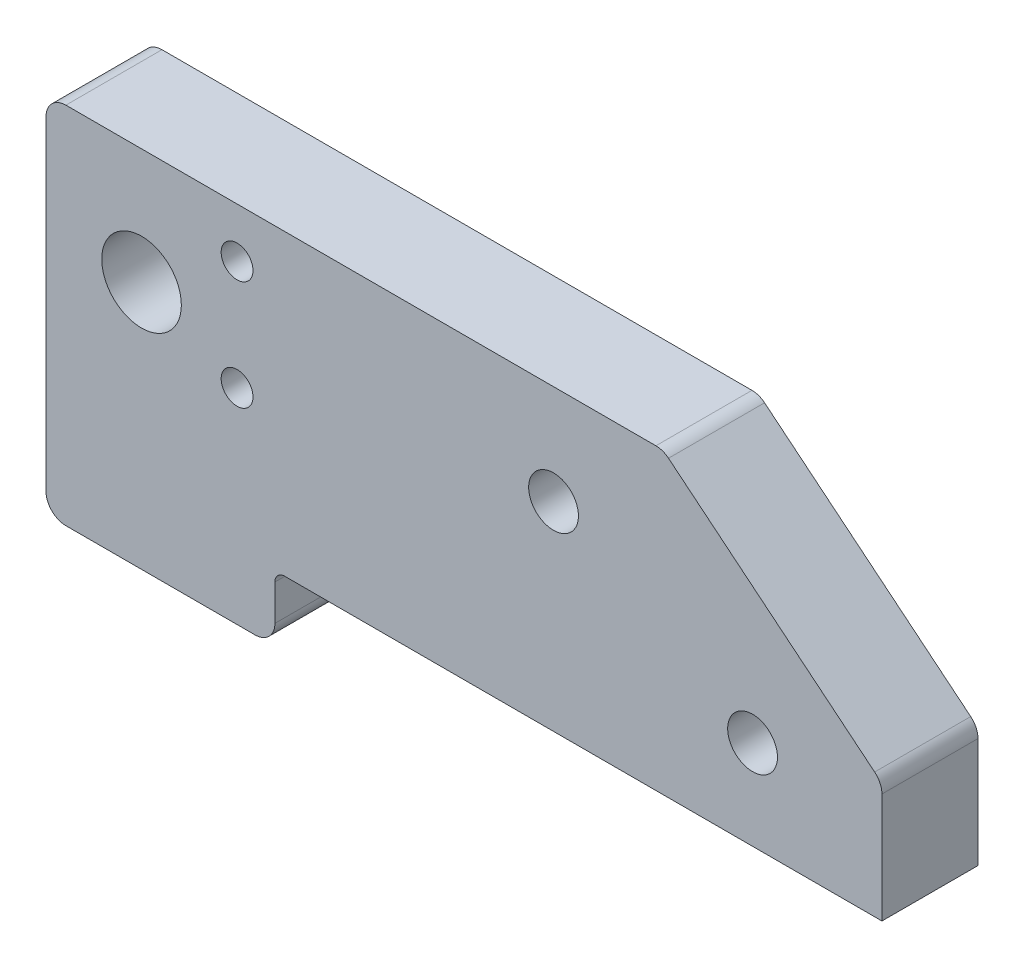
ISO-10303-21;
HEADER;
FILE_DESCRIPTION(('STEP AP214'),'2;1');
FILE_NAME('part.step','',(''),(''),'','','');
FILE_SCHEMA(('AUTOMOTIVE_DESIGN { 1 0 10303 214 1 1 1 1 }'));
ENDSEC;
DATA;
#1=APPLICATION_CONTEXT('core data for automotive mechanical design processes');
#2=APPLICATION_PROTOCOL_DEFINITION('international standard','automotive_design',2000,#1);
#3=PRODUCT_CONTEXT('',#1,'mechanical');
#4=PRODUCT('Part','Part','',(#3));
#5=PRODUCT_RELATED_PRODUCT_CATEGORY('part','',(#4));
#6=PRODUCT_DEFINITION_FORMATION('','',#4);
#7=PRODUCT_DEFINITION_CONTEXT('part definition',#1,'design');
#8=PRODUCT_DEFINITION('design','',#6,#7);
#9=PRODUCT_DEFINITION_SHAPE('','',#8);
#10=(LENGTH_UNIT() NAMED_UNIT(*) SI_UNIT(.MILLI.,.METRE.));
#11=(NAMED_UNIT(*) PLANE_ANGLE_UNIT() SI_UNIT($,.RADIAN.));
#12=(NAMED_UNIT(*) SI_UNIT($,.STERADIAN.) SOLID_ANGLE_UNIT());
#13=UNCERTAINTY_MEASURE_WITH_UNIT(LENGTH_MEASURE(1.E-05),#10,'distance_accuracy_value','');
#14=(GEOMETRIC_REPRESENTATION_CONTEXT(3) GLOBAL_UNCERTAINTY_ASSIGNED_CONTEXT((#13)) GLOBAL_UNIT_ASSIGNED_CONTEXT((#10,
#11,#12)) REPRESENTATION_CONTEXT('',''));
#15=CARTESIAN_POINT('',(0.,0.,0.));
#16=DIRECTION('',(0.,0.,1.));
#17=DIRECTION('',(1.,0.,0.));
#18=AXIS2_PLACEMENT_3D('',#15,#16,#17);
#19=CARTESIAN_POINT('',(0.,0.,4.826));
#20=DIRECTION('',(0.,-1.,0.));
#21=DIRECTION('',(1.,0.,0.));
#22=AXIS2_PLACEMENT_3D('',#19,#20,#21);
#23=PLANE('',#22);
#24=CARTESIAN_POINT('',(-4.,0.,2.413));
#25=DIRECTION('',(0.,-1.,0.));
#26=DIRECTION('',(0.,0.,-1.));
#27=AXIS2_PLACEMENT_3D('',#24,#25,#26);
#28=CIRCLE('',#27,1.24999999999999);
#29=CARTESIAN_POINT('',(-4.,0.,1.16300000000001));
#30=VERTEX_POINT('',#29);
#31=EDGE_CURVE('E146',#30,#30,#28,.T.);
#32=ORIENTED_EDGE('',*,*,#31,.F.);
#33=EDGE_LOOP('',(#32));
#34=FACE_BOUND('',#33,.T.);
#35=CARTESIAN_POINT('',(8.,0.,2.413));
#36=DIRECTION('',(0.,-1.,0.));
#37=DIRECTION('',(0.,0.,-1.));
#38=AXIS2_PLACEMENT_3D('',#35,#36,#37);
#39=CIRCLE('',#38,1.24999999999999);
#40=CARTESIAN_POINT('',(8.,0.,1.16300000000001));
#41=VERTEX_POINT('',#40);
#42=EDGE_CURVE('E145',#41,#41,#39,.T.);
#43=ORIENTED_EDGE('',*,*,#42,.F.);
#44=EDGE_LOOP('',(#43));
#45=FACE_BOUND('',#44,.T.);
#46=DIRECTION('',(-1.,0.,0.));
#47=VECTOR('',#46,1.);
#48=CARTESIAN_POINT('',(0.,0.,4.826));
#49=LINE('',#48,#47);
#50=CARTESIAN_POINT('',(11.,0.,4.826));
#51=VERTEX_POINT('',#50);
#52=CARTESIAN_POINT('',(-19.,0.,4.826));
#53=VERTEX_POINT('',#52);
#54=EDGE_CURVE('E165',#51,#53,#49,.T.);
#55=ORIENTED_EDGE('',*,*,#54,.T.);
#56=DIRECTION('',(0.,0.,-1.));
#57=VECTOR('',#56,1.);
#58=CARTESIAN_POINT('',(-19.,0.,0.));
#59=LINE('',#58,#57);
#60=CARTESIAN_POINT('',(-19.,0.,0.));
#61=VERTEX_POINT('',#60);
#62=EDGE_CURVE('E234',#53,#61,#59,.T.);
#63=ORIENTED_EDGE('',*,*,#62,.T.);
#64=DIRECTION('',(-1.,0.,0.));
#65=VECTOR('',#64,1.);
#66=CARTESIAN_POINT('',(0.,0.,0.));
#67=LINE('',#66,#65);
#68=CARTESIAN_POINT('',(11.,0.,0.));
#69=VERTEX_POINT('',#68);
#70=EDGE_CURVE('E164',#69,#61,#67,.T.);
#71=ORIENTED_EDGE('',*,*,#70,.F.);
#72=DIRECTION('',(0.,0.,-1.));
#73=VECTOR('',#72,1.);
#74=CARTESIAN_POINT('',(11.,0.,4.826));
#75=LINE('',#74,#73);
#76=EDGE_CURVE('E177',#51,#69,#75,.T.);
#77=ORIENTED_EDGE('',*,*,#76,.F.);
#78=EDGE_LOOP('',(#55,#63,#71,#77));
#79=FACE_BOUND('',#78,.T.);
#80=ADVANCED_FACE('F38',(#34,#45,#79),#23,.T.);
#81=CARTESIAN_POINT('',(11.,0.,4.826));
#82=DIRECTION('',(1.,0.,0.));
#83=DIRECTION('',(0.,1.,0.));
#84=AXIS2_PLACEMENT_3D('',#81,#82,#83);
#85=PLANE('',#84);
#86=DIRECTION('',(0.,-1.,0.));
#87=VECTOR('',#86,1.);
#88=CARTESIAN_POINT('',(11.,0.,0.));
#89=LINE('',#88,#87);
#90=CARTESIAN_POINT('',(11.,5.52612087240437,0.));
#91=VERTEX_POINT('',#90);
#92=EDGE_CURVE('E179',#91,#69,#89,.T.);
#93=ORIENTED_EDGE('',*,*,#92,.F.);
#94=DIRECTION('',(0.,0.,-1.));
#95=VECTOR('',#94,1.);
#96=CARTESIAN_POINT('',(11.,5.52612087240437,4.826));
#97=LINE('',#96,#95);
#98=CARTESIAN_POINT('',(11.,5.52612087240437,4.826));
#99=VERTEX_POINT('',#98);
#100=EDGE_CURVE('E203',#91,#99,#97,.F.);
#101=ORIENTED_EDGE('',*,*,#100,.T.);
#102=DIRECTION('',(0.,-1.,0.));
#103=VECTOR('',#102,1.);
#104=CARTESIAN_POINT('',(11.,0.,4.826));
#105=LINE('',#104,#103);
#106=EDGE_CURVE('E168',#99,#51,#105,.T.);
#107=ORIENTED_EDGE('',*,*,#106,.T.);
#108=ORIENTED_EDGE('',*,*,#76,.T.);
#109=EDGE_LOOP('',(#93,#101,#107,#108));
#110=FACE_BOUND('',#109,.T.);
#111=ADVANCED_FACE('F249',(#110),#85,.T.);
#112=CARTESIAN_POINT('',(7.35148514851485,8.98514851485148,4.826));
#113=DIRECTION('',(0.633237790257263,0.773957299203321,0.));
#114=DIRECTION('',(-0.773957299203321,0.633237790257263,0.));
#115=AXIS2_PLACEMENT_3D('',#112,#113,#114);
#116=PLANE('',#115);
#117=DIRECTION('',(0.773957299203321,-0.633237790257263,0.));
#118=VECTOR('',#117,1.);
#119=CARTESIAN_POINT('',(7.35148514851485,8.98514851485148,4.826));
#120=LINE('',#119,#118);
#121=CARTESIAN_POINT('',(0.276274412084827,14.7739572992033,4.826));
#122=VERTEX_POINT('',#121);
#123=CARTESIAN_POINT('',(10.6332377902573,6.3000781716077,4.826));
#124=VERTEX_POINT('',#123);
#125=EDGE_CURVE('E171',#122,#124,#120,.T.);
#126=ORIENTED_EDGE('',*,*,#125,.T.);
#127=DIRECTION('',(0.,0.,-1.));
#128=VECTOR('',#127,1.);
#129=CARTESIAN_POINT('',(10.6332377902573,6.3000781716077,4.826));
#130=LINE('',#129,#128);
#131=CARTESIAN_POINT('',(10.6332377902573,6.3000781716077,0.));
#132=VERTEX_POINT('',#131);
#133=EDGE_CURVE('E190',#124,#132,#130,.T.);
#134=ORIENTED_EDGE('',*,*,#133,.T.);
#135=DIRECTION('',(0.773957299203321,-0.633237790257263,0.));
#136=VECTOR('',#135,1.);
#137=CARTESIAN_POINT('',(7.35148514851485,8.98514851485148,0.));
#138=LINE('',#137,#136);
#139=CARTESIAN_POINT('',(0.276274412084827,14.7739572992033,0.));
#140=VERTEX_POINT('',#139);
#141=EDGE_CURVE('E181',#140,#132,#138,.T.);
#142=ORIENTED_EDGE('',*,*,#141,.F.);
#143=DIRECTION('',(0.,0.,-1.));
#144=VECTOR('',#143,1.);
#145=CARTESIAN_POINT('',(0.276274412084828,14.7739572992033,4.826));
#146=LINE('',#145,#144);
#147=EDGE_CURVE('E188',#140,#122,#146,.F.);
#148=ORIENTED_EDGE('',*,*,#147,.T.);
#149=EDGE_LOOP('',(#126,#134,#142,#148));
#150=FACE_BOUND('',#149,.T.);
#151=ADVANCED_FACE('F270',(#150),#116,.T.);
#152=CARTESIAN_POINT('',(0.,15.,4.826));
#153=DIRECTION('',(0.,-1.,0.));
#154=DIRECTION('',(1.,0.,0.));
#155=AXIS2_PLACEMENT_3D('',#152,#153,#154);
#156=PLANE('',#155);
#157=DIRECTION('',(-1.,0.,0.));
#158=VECTOR('',#157,1.);
#159=CARTESIAN_POINT('',(0.,15.,4.826));
#160=LINE('',#159,#158);
#161=CARTESIAN_POINT('',(-0.356963378172435,15.,4.826));
#162=VERTEX_POINT('',#161);
#163=CARTESIAN_POINT('',(-30.,15.,4.826));
#164=VERTEX_POINT('',#163);
#165=EDGE_CURVE('E174',#162,#164,#160,.T.);
#166=ORIENTED_EDGE('',*,*,#165,.F.);
#167=DIRECTION('',(0.,0.,-1.));
#168=VECTOR('',#167,1.);
#169=CARTESIAN_POINT('',(-0.356963378172435,15.,0.));
#170=LINE('',#169,#168);
#171=CARTESIAN_POINT('',(-0.356963378172435,15.,0.));
#172=VERTEX_POINT('',#171);
#173=EDGE_CURVE('E218',#162,#172,#170,.T.);
#174=ORIENTED_EDGE('',*,*,#173,.T.);
#175=DIRECTION('',(-1.,0.,0.));
#176=VECTOR('',#175,1.);
#177=CARTESIAN_POINT('',(0.,15.,0.));
#178=LINE('',#177,#176);
#179=CARTESIAN_POINT('',(-30.,15.,0.));
#180=VERTEX_POINT('',#179);
#181=EDGE_CURVE('E169',#172,#180,#178,.T.);
#182=ORIENTED_EDGE('',*,*,#181,.T.);
#183=DIRECTION('',(0.,0.,-1.));
#184=VECTOR('',#183,1.);
#185=CARTESIAN_POINT('',(-30.,15.,4.826));
#186=LINE('',#185,#184);
#187=EDGE_CURVE('E216',#180,#164,#186,.F.);
#188=ORIENTED_EDGE('',*,*,#187,.T.);
#189=EDGE_LOOP('',(#166,#174,#182,#188));
#190=FACE_BOUND('',#189,.T.);
#191=ADVANCED_FACE('F339',(#190),#156,.F.);
#192=CARTESIAN_POINT('',(0.,0.,4.826));
#193=DIRECTION('',(0.,0.,1.));
#194=DIRECTION('',(1.,0.,0.));
#195=AXIS2_PLACEMENT_3D('',#192,#193,#194);
#196=PLANE('',#195);
#197=CARTESIAN_POINT('',(-21.4,12.5,4.826));
#198=DIRECTION('',(0.,0.,1.));
#199=DIRECTION('',(1.,0.,0.));
#200=AXIS2_PLACEMENT_3D('',#197,#198,#199);
#201=CIRCLE('',#200,0.800000000000012);
#202=CARTESIAN_POINT('',(-20.6,12.5,4.826));
#203=VERTEX_POINT('',#202);
#204=EDGE_CURVE('E592',#203,#203,#201,.T.);
#205=ORIENTED_EDGE('',*,*,#204,.F.);
#206=EDGE_LOOP('',(#205));
#207=FACE_BOUND('',#206,.T.);
#208=CARTESIAN_POINT('',(-21.4,7.,4.826));
#209=DIRECTION('',(0.,0.,1.));
#210=DIRECTION('',(1.,0.,0.));
#211=AXIS2_PLACEMENT_3D('',#208,#209,#210);
#212=CIRCLE('',#211,0.800000000000012);
#213=CARTESIAN_POINT('',(-20.6,7.,4.826));
#214=VERTEX_POINT('',#213);
#215=EDGE_CURVE('E586',#214,#214,#212,.T.);
#216=ORIENTED_EDGE('',*,*,#215,.F.);
#217=EDGE_LOOP('',(#216));
#218=FACE_BOUND('',#217,.T.);
#219=CARTESIAN_POINT('',(4.5,4.5,4.826));
#220=DIRECTION('',(0.,0.,1.));
#221=DIRECTION('',(1.,0.,0.));
#222=AXIS2_PLACEMENT_3D('',#219,#220,#221);
#223=CIRCLE('',#222,1.24999999999999);
#224=CARTESIAN_POINT('',(5.74999999999999,4.5,4.826));
#225=VERTEX_POINT('',#224);
#226=EDGE_CURVE('E322',#225,#225,#223,.T.);
#227=ORIENTED_EDGE('',*,*,#226,.F.);
#228=EDGE_LOOP('',(#227));
#229=FACE_BOUND('',#228,.T.);
#230=CARTESIAN_POINT('',(-5.5,10.,4.826));
#231=DIRECTION('',(0.,0.,1.));
#232=DIRECTION('',(1.,0.,0.));
#233=AXIS2_PLACEMENT_3D('',#230,#231,#232);
#234=CIRCLE('',#233,1.25);
#235=CARTESIAN_POINT('',(-4.25,10.,4.826));
#236=VERTEX_POINT('',#235);
#237=EDGE_CURVE('E158',#236,#236,#234,.T.);
#238=ORIENTED_EDGE('',*,*,#237,.F.);
#239=EDGE_LOOP('',(#238));
#240=FACE_BOUND('',#239,.T.);
#241=ORIENTED_EDGE('',*,*,#106,.F.);
#242=CARTESIAN_POINT('',(10.,5.52612087240437,4.826));
#243=DIRECTION('',(0.,0.,1.));
#244=DIRECTION('',(1.,0.,0.));
#245=AXIS2_PLACEMENT_3D('',#242,#243,#244);
#246=CIRCLE('',#245,1.);
#247=EDGE_CURVE('E214',#99,#124,#246,.T.);
#248=ORIENTED_EDGE('',*,*,#247,.T.);
#249=ORIENTED_EDGE('',*,*,#125,.F.);
#250=CARTESIAN_POINT('',(-0.356963378172434,14.,4.826));
#251=DIRECTION('',(0.,0.,1.));
#252=DIRECTION('',(1.,0.,0.));
#253=AXIS2_PLACEMENT_3D('',#250,#251,#252);
#254=CIRCLE('',#253,1.);
#255=EDGE_CURVE('E212',#122,#162,#254,.T.);
#256=ORIENTED_EDGE('',*,*,#255,.T.);
#257=ORIENTED_EDGE('',*,*,#165,.T.);
#258=CARTESIAN_POINT('',(-30.,14.,4.826));
#259=DIRECTION('',(0.,0.,1.));
#260=DIRECTION('',(1.,0.,0.));
#261=AXIS2_PLACEMENT_3D('',#258,#259,#260);
#262=CIRCLE('',#261,1.);
#263=CARTESIAN_POINT('',(-31.,14.,4.826));
#264=VERTEX_POINT('',#263);
#265=EDGE_CURVE('E210',#164,#264,#262,.T.);
#266=ORIENTED_EDGE('',*,*,#265,.T.);
#267=DIRECTION('',(0.,1.,0.));
#268=VECTOR('',#267,1.);
#269=CARTESIAN_POINT('',(-31.,0.,4.826));
#270=LINE('',#269,#268);
#271=CARTESIAN_POINT('',(-31.,-2.3,4.826));
#272=VERTEX_POINT('',#271);
#273=EDGE_CURVE('E309',#272,#264,#270,.T.);
#274=ORIENTED_EDGE('',*,*,#273,.F.);
#275=CARTESIAN_POINT('',(-30.,-2.3,4.826));
#276=DIRECTION('',(0.,0.,1.));
#277=DIRECTION('',(1.,0.,0.));
#278=AXIS2_PLACEMENT_3D('',#275,#276,#277);
#279=CIRCLE('',#278,1.);
#280=CARTESIAN_POINT('',(-30.,-3.3,4.826));
#281=VERTEX_POINT('',#280);
#282=EDGE_CURVE('E205',#272,#281,#279,.T.);
#283=ORIENTED_EDGE('',*,*,#282,.T.);
#284=DIRECTION('',(-1.,0.,0.));
#285=VECTOR('',#284,1.);
#286=CARTESIAN_POINT('',(0.,-3.3,4.826));
#287=LINE('',#286,#285);
#288=CARTESIAN_POINT('',(-20.5,-3.3,4.826));
#289=VERTEX_POINT('',#288);
#290=EDGE_CURVE('E306',#289,#281,#287,.T.);
#291=ORIENTED_EDGE('',*,*,#290,.F.);
#292=CARTESIAN_POINT('',(-20.5,-2.3,4.826));
#293=DIRECTION('',(0.,0.,1.));
#294=DIRECTION('',(1.,0.,0.));
#295=AXIS2_PLACEMENT_3D('',#292,#293,#294);
#296=CIRCLE('',#295,1.);
#297=CARTESIAN_POINT('',(-19.5,-2.3,4.826));
#298=VERTEX_POINT('',#297);
#299=EDGE_CURVE('E207',#289,#298,#296,.T.);
#300=ORIENTED_EDGE('',*,*,#299,.T.);
#301=DIRECTION('',(0.,-1.,0.));
#302=VECTOR('',#301,1.);
#303=CARTESIAN_POINT('',(-19.5,0.,4.826));
#304=LINE('',#303,#302);
#305=CARTESIAN_POINT('',(-19.5,-0.5,4.826));
#306=VERTEX_POINT('',#305);
#307=EDGE_CURVE('E255',#306,#298,#304,.T.);
#308=ORIENTED_EDGE('',*,*,#307,.F.);
#309=CARTESIAN_POINT('',(-19.,-0.5,4.826));
#310=DIRECTION('',(0.,0.,1.));
#311=DIRECTION('',(1.,0.,0.));
#312=AXIS2_PLACEMENT_3D('',#309,#310,#311);
#313=CIRCLE('',#312,0.5);
#314=EDGE_CURVE('E11',#306,#53,#313,.F.);
#315=ORIENTED_EDGE('',*,*,#314,.T.);
#316=ORIENTED_EDGE('',*,*,#54,.F.);
#317=EDGE_LOOP('',(#241,#248,#249,#256,#257,#266,#274,#283,#291,#300,#308,#315,#316));
#318=FACE_BOUND('',#317,.T.);
#319=CARTESIAN_POINT('',(-26.2,9.2,4.826));
#320=DIRECTION('',(0.,0.,1.));
#321=DIRECTION('',(1.,0.,0.));
#322=AXIS2_PLACEMENT_3D('',#319,#320,#321);
#323=CIRCLE('',#322,2.);
#324=CARTESIAN_POINT('',(-24.2,9.2,4.826));
#325=VERTEX_POINT('',#324);
#326=EDGE_CURVE('E316',#325,#325,#323,.T.);
#327=ORIENTED_EDGE('',*,*,#326,.F.);
#328=EDGE_LOOP('',(#327));
#329=FACE_BOUND('',#328,.T.);
#330=ADVANCED_FACE('F252',(#207,#218,#229,#240,#318,#329),#196,.T.);
#331=CARTESIAN_POINT('',(0.,0.,0.));
#332=DIRECTION('',(0.,0.,1.));
#333=DIRECTION('',(1.,0.,0.));
#334=AXIS2_PLACEMENT_3D('',#331,#332,#333);
#335=PLANE('',#334);
#336=CARTESIAN_POINT('',(-21.4,12.5,0.));
#337=DIRECTION('',(0.,0.,1.));
#338=DIRECTION('',(1.,0.,0.));
#339=AXIS2_PLACEMENT_3D('',#336,#337,#338);
#340=CIRCLE('',#339,0.800000000000012);
#341=CARTESIAN_POINT('',(-20.6,12.5,0.));
#342=VERTEX_POINT('',#341);
#343=EDGE_CURVE('E589',#342,#342,#340,.T.);
#344=ORIENTED_EDGE('',*,*,#343,.T.);
#345=EDGE_LOOP('',(#344));
#346=FACE_BOUND('',#345,.T.);
#347=CARTESIAN_POINT('',(-21.4,7.,0.));
#348=DIRECTION('',(0.,0.,1.));
#349=DIRECTION('',(1.,0.,0.));
#350=AXIS2_PLACEMENT_3D('',#347,#348,#349);
#351=CIRCLE('',#350,0.800000000000012);
#352=CARTESIAN_POINT('',(-20.6,7.,0.));
#353=VERTEX_POINT('',#352);
#354=EDGE_CURVE('E318',#353,#353,#351,.T.);
#355=ORIENTED_EDGE('',*,*,#354,.T.);
#356=EDGE_LOOP('',(#355));
#357=FACE_BOUND('',#356,.T.);
#358=CARTESIAN_POINT('',(4.5,4.5,0.));
#359=DIRECTION('',(0.,0.,1.));
#360=DIRECTION('',(1.,0.,0.));
#361=AXIS2_PLACEMENT_3D('',#358,#359,#360);
#362=CIRCLE('',#361,1.25);
#363=CARTESIAN_POINT('',(5.75,4.5,0.));
#364=VERTEX_POINT('',#363);
#365=EDGE_CURVE('E152',#364,#364,#362,.T.);
#366=ORIENTED_EDGE('',*,*,#365,.T.);
#367=EDGE_LOOP('',(#366));
#368=FACE_BOUND('',#367,.T.);
#369=CARTESIAN_POINT('',(-5.5,10.,0.));
#370=DIRECTION('',(0.,0.,1.));
#371=DIRECTION('',(1.,0.,0.));
#372=AXIS2_PLACEMENT_3D('',#369,#370,#371);
#373=CIRCLE('',#372,1.25);
#374=CARTESIAN_POINT('',(-4.25,10.,0.));
#375=VERTEX_POINT('',#374);
#376=EDGE_CURVE('E161',#375,#375,#373,.T.);
#377=ORIENTED_EDGE('',*,*,#376,.T.);
#378=EDGE_LOOP('',(#377));
#379=FACE_BOUND('',#378,.T.);
#380=ORIENTED_EDGE('',*,*,#141,.T.);
#381=CARTESIAN_POINT('',(10.,5.52612087240437,0.));
#382=DIRECTION('',(0.,0.,1.));
#383=DIRECTION('',(1.,0.,0.));
#384=AXIS2_PLACEMENT_3D('',#381,#382,#383);
#385=CIRCLE('',#384,1.);
#386=EDGE_CURVE('E201',#132,#91,#385,.F.);
#387=ORIENTED_EDGE('',*,*,#386,.T.);
#388=ORIENTED_EDGE('',*,*,#92,.T.);
#389=ORIENTED_EDGE('',*,*,#70,.T.);
#390=CARTESIAN_POINT('',(-19.,-0.5,0.));
#391=DIRECTION('',(0.,0.,1.));
#392=DIRECTION('',(1.,0.,0.));
#393=AXIS2_PLACEMENT_3D('',#390,#391,#392);
#394=CIRCLE('',#393,0.5);
#395=CARTESIAN_POINT('',(-19.5,-0.5,0.));
#396=VERTEX_POINT('',#395);
#397=EDGE_CURVE('E46',#61,#396,#394,.T.);
#398=ORIENTED_EDGE('',*,*,#397,.T.);
#399=DIRECTION('',(0.,-1.,0.));
#400=VECTOR('',#399,1.);
#401=CARTESIAN_POINT('',(-19.5,0.,0.));
#402=LINE('',#401,#400);
#403=CARTESIAN_POINT('',(-19.5,-2.3,0.));
#404=VERTEX_POINT('',#403);
#405=EDGE_CURVE('E382',#396,#404,#402,.T.);
#406=ORIENTED_EDGE('',*,*,#405,.T.);
#407=CARTESIAN_POINT('',(-20.5,-2.3,0.));
#408=DIRECTION('',(0.,0.,1.));
#409=DIRECTION('',(1.,0.,0.));
#410=AXIS2_PLACEMENT_3D('',#407,#408,#409);
#411=CIRCLE('',#410,1.);
#412=CARTESIAN_POINT('',(-20.5,-3.3,0.));
#413=VERTEX_POINT('',#412);
#414=EDGE_CURVE('E195',#404,#413,#411,.F.);
#415=ORIENTED_EDGE('',*,*,#414,.T.);
#416=DIRECTION('',(-1.,0.,0.));
#417=VECTOR('',#416,1.);
#418=CARTESIAN_POINT('',(0.,-3.3,0.));
#419=LINE('',#418,#417);
#420=CARTESIAN_POINT('',(-30.,-3.3,0.));
#421=VERTEX_POINT('',#420);
#422=EDGE_CURVE('E380',#413,#421,#419,.T.);
#423=ORIENTED_EDGE('',*,*,#422,.T.);
#424=CARTESIAN_POINT('',(-30.,-2.3,0.));
#425=DIRECTION('',(0.,0.,1.));
#426=DIRECTION('',(1.,0.,0.));
#427=AXIS2_PLACEMENT_3D('',#424,#425,#426);
#428=CIRCLE('',#427,1.);
#429=CARTESIAN_POINT('',(-31.,-2.3,0.));
#430=VERTEX_POINT('',#429);
#431=EDGE_CURVE('E193',#421,#430,#428,.F.);
#432=ORIENTED_EDGE('',*,*,#431,.T.);
#433=DIRECTION('',(0.,1.,0.));
#434=VECTOR('',#433,1.);
#435=CARTESIAN_POINT('',(-31.,0.,0.));
#436=LINE('',#435,#434);
#437=CARTESIAN_POINT('',(-31.,14.,0.));
#438=VERTEX_POINT('',#437);
#439=EDGE_CURVE('E324',#430,#438,#436,.T.);
#440=ORIENTED_EDGE('',*,*,#439,.T.);
#441=CARTESIAN_POINT('',(-30.,14.,0.));
#442=DIRECTION('',(0.,0.,1.));
#443=DIRECTION('',(1.,0.,0.));
#444=AXIS2_PLACEMENT_3D('',#441,#442,#443);
#445=CIRCLE('',#444,1.);
#446=EDGE_CURVE('E197',#438,#180,#445,.F.);
#447=ORIENTED_EDGE('',*,*,#446,.T.);
#448=ORIENTED_EDGE('',*,*,#181,.F.);
#449=CARTESIAN_POINT('',(-0.356963378172434,14.,0.));
#450=DIRECTION('',(0.,0.,1.));
#451=DIRECTION('',(1.,0.,0.));
#452=AXIS2_PLACEMENT_3D('',#449,#450,#451);
#453=CIRCLE('',#452,1.);
#454=EDGE_CURVE('E199',#172,#140,#453,.F.);
#455=ORIENTED_EDGE('',*,*,#454,.T.);
#456=EDGE_LOOP('',(#380,#387,#388,#389,#398,#406,#415,#423,#432,#440,#447,#448,#455));
#457=FACE_BOUND('',#456,.T.);
#458=CARTESIAN_POINT('',(-26.2,9.2,0.));
#459=DIRECTION('',(0.,0.,1.));
#460=DIRECTION('',(1.,0.,0.));
#461=AXIS2_PLACEMENT_3D('',#458,#459,#460);
#462=CIRCLE('',#461,2.);
#463=CARTESIAN_POINT('',(-24.2,9.2,0.));
#464=VERTEX_POINT('',#463);
#465=EDGE_CURVE('E386',#464,#464,#462,.T.);
#466=ORIENTED_EDGE('',*,*,#465,.T.);
#467=EDGE_LOOP('',(#466));
#468=FACE_BOUND('',#467,.T.);
#469=ADVANCED_FACE('F244',(#346,#357,#368,#379,#457,#468),#335,.F.);
#470=CARTESIAN_POINT('',(-5.5,10.,4.826));
#471=DIRECTION('',(0.,0.,1.));
#472=DIRECTION('',(1.,0.,0.));
#473=AXIS2_PLACEMENT_3D('',#470,#471,#472);
#474=CYLINDRICAL_SURFACE('',#473,1.25);
#475=ORIENTED_EDGE('',*,*,#376,.F.);
#476=EDGE_LOOP('',(#475));
#477=FACE_BOUND('',#476,.T.);
#478=ORIENTED_EDGE('',*,*,#237,.T.);
#479=EDGE_LOOP('',(#478));
#480=FACE_BOUND('',#479,.T.);
#481=ADVANCED_FACE('F344',(#477,#480),#474,.F.);
#482=CARTESIAN_POINT('',(8.,5.,2.413));
#483=DIRECTION('',(0.,-1.,0.));
#484=DIRECTION('',(0.,0.,-1.));
#485=AXIS2_PLACEMENT_3D('',#482,#483,#484);
#486=CONICAL_SURFACE('',#485,1.25,1.02974425867665);
#487=CARTESIAN_POINT('',(8.,5.75107577378445,2.413));
#488=VERTEX_POINT('',#487);
#489=VERTEX_LOOP('',#488);
#490=FACE_BOUND('',#489,.T.);
#491=CARTESIAN_POINT('',(8.,5.,2.413));
#492=DIRECTION('',(0.,-1.,0.));
#493=DIRECTION('',(0.,0.,-1.));
#494=AXIS2_PLACEMENT_3D('',#491,#492,#493);
#495=CIRCLE('',#494,1.25);
#496=CARTESIAN_POINT('',(8.,5.,1.163));
#497=VERTEX_POINT('',#496);
#498=EDGE_CURVE('E149',#497,#497,#495,.T.);
#499=ORIENTED_EDGE('',*,*,#498,.T.);
#500=EDGE_LOOP('',(#499));
#501=FACE_BOUND('',#500,.T.);
#502=ADVANCED_FACE('F346',(#490,#501),#486,.F.);
#503=CARTESIAN_POINT('',(8.,0.,2.413));
#504=DIRECTION('',(0.,-1.,0.));
#505=DIRECTION('',(0.,0.,-1.));
#506=AXIS2_PLACEMENT_3D('',#503,#504,#505);
#507=CYLINDRICAL_SURFACE('',#506,1.24999999999999);
#508=ORIENTED_EDGE('',*,*,#498,.F.);
#509=EDGE_LOOP('',(#508));
#510=FACE_BOUND('',#509,.T.);
#511=ORIENTED_EDGE('',*,*,#42,.T.);
#512=EDGE_LOOP('',(#511));
#513=FACE_BOUND('',#512,.T.);
#514=ADVANCED_FACE('F139',(#510,#513),#507,.F.);
#515=CARTESIAN_POINT('',(-4.,5.,2.413));
#516=DIRECTION('',(0.,-1.,0.));
#517=DIRECTION('',(0.,0.,-1.));
#518=AXIS2_PLACEMENT_3D('',#515,#516,#517);
#519=CONICAL_SURFACE('',#518,1.25,1.02974425867665);
#520=CARTESIAN_POINT('',(-4.,5.75107577378445,2.413));
#521=VERTEX_POINT('',#520);
#522=VERTEX_LOOP('',#521);
#523=FACE_BOUND('',#522,.T.);
#524=CARTESIAN_POINT('',(-4.,5.,2.413));
#525=DIRECTION('',(0.,-1.,0.));
#526=DIRECTION('',(0.,0.,-1.));
#527=AXIS2_PLACEMENT_3D('',#524,#525,#526);
#528=CIRCLE('',#527,1.25);
#529=CARTESIAN_POINT('',(-4.,5.,1.163));
#530=VERTEX_POINT('',#529);
#531=EDGE_CURVE('E143',#530,#530,#528,.T.);
#532=ORIENTED_EDGE('',*,*,#531,.T.);
#533=EDGE_LOOP('',(#532));
#534=FACE_BOUND('',#533,.T.);
#535=ADVANCED_FACE('F135',(#523,#534),#519,.F.);
#536=CARTESIAN_POINT('',(-4.,0.,2.413));
#537=DIRECTION('',(0.,-1.,0.));
#538=DIRECTION('',(0.,0.,-1.));
#539=AXIS2_PLACEMENT_3D('',#536,#537,#538);
#540=CYLINDRICAL_SURFACE('',#539,1.24999999999999);
#541=ORIENTED_EDGE('',*,*,#531,.F.);
#542=EDGE_LOOP('',(#541));
#543=FACE_BOUND('',#542,.T.);
#544=ORIENTED_EDGE('',*,*,#31,.T.);
#545=EDGE_LOOP('',(#544));
#546=FACE_BOUND('',#545,.T.);
#547=ADVANCED_FACE('F138',(#543,#546),#540,.F.);
#548=CARTESIAN_POINT('',(4.5,4.5,4.826));
#549=DIRECTION('',(0.,0.,1.));
#550=DIRECTION('',(1.,0.,0.));
#551=AXIS2_PLACEMENT_3D('',#548,#549,#550);
#552=CYLINDRICAL_SURFACE('',#551,1.24999999999999);
#553=ORIENTED_EDGE('',*,*,#365,.F.);
#554=EDGE_LOOP('',(#553));
#555=FACE_BOUND('',#554,.T.);
#556=ORIENTED_EDGE('',*,*,#226,.T.);
#557=EDGE_LOOP('',(#556));
#558=FACE_BOUND('',#557,.T.);
#559=ADVANCED_FACE('F330',(#555,#558),#552,.F.);
#560=CARTESIAN_POINT('',(-31.,0.,31.93485464198));
#561=DIRECTION('',(-1.,0.,0.));
#562=DIRECTION('',(0.,-1.,0.));
#563=AXIS2_PLACEMENT_3D('',#560,#561,#562);
#564=PLANE('',#563);
#565=ORIENTED_EDGE('',*,*,#273,.T.);
#566=DIRECTION('',(0.,0.,-1.));
#567=VECTOR('',#566,1.);
#568=CARTESIAN_POINT('',(-31.,14.,0.));
#569=LINE('',#568,#567);
#570=EDGE_CURVE('E223',#264,#438,#569,.T.);
#571=ORIENTED_EDGE('',*,*,#570,.T.);
#572=ORIENTED_EDGE('',*,*,#439,.F.);
#573=DIRECTION('',(0.,0.,-1.));
#574=VECTOR('',#573,1.);
#575=CARTESIAN_POINT('',(-31.,-2.3,31.93485464198));
#576=LINE('',#575,#574);
#577=EDGE_CURVE('E221',#430,#272,#576,.F.);
#578=ORIENTED_EDGE('',*,*,#577,.T.);
#579=EDGE_LOOP('',(#565,#571,#572,#578));
#580=FACE_BOUND('',#579,.T.);
#581=ADVANCED_FACE('F333',(#580),#564,.T.);
#582=CARTESIAN_POINT('',(0.,-3.3,31.93485464198));
#583=DIRECTION('',(0.,-1.,0.));
#584=DIRECTION('',(1.,0.,0.));
#585=AXIS2_PLACEMENT_3D('',#582,#583,#584);
#586=PLANE('',#585);
#587=ORIENTED_EDGE('',*,*,#422,.F.);
#588=DIRECTION('',(0.,0.,-1.));
#589=VECTOR('',#588,1.);
#590=CARTESIAN_POINT('',(-20.5,-3.3,31.93485464198));
#591=LINE('',#590,#589);
#592=EDGE_CURVE('E232',#413,#289,#591,.F.);
#593=ORIENTED_EDGE('',*,*,#592,.T.);
#594=ORIENTED_EDGE('',*,*,#290,.T.);
#595=DIRECTION('',(0.,0.,-1.));
#596=VECTOR('',#595,1.);
#597=CARTESIAN_POINT('',(-30.,-3.3,31.93485464198));
#598=LINE('',#597,#596);
#599=EDGE_CURVE('E229',#281,#421,#598,.T.);
#600=ORIENTED_EDGE('',*,*,#599,.T.);
#601=EDGE_LOOP('',(#587,#593,#594,#600));
#602=FACE_BOUND('',#601,.T.);
#603=ADVANCED_FACE('F312',(#602),#586,.T.);
#604=CARTESIAN_POINT('',(-19.5,0.,31.93485464198));
#605=DIRECTION('',(1.,0.,0.));
#606=DIRECTION('',(0.,1.,0.));
#607=AXIS2_PLACEMENT_3D('',#604,#605,#606);
#608=PLANE('',#607);
#609=ORIENTED_EDGE('',*,*,#405,.F.);
#610=DIRECTION('',(0.,0.,-1.));
#611=VECTOR('',#610,1.);
#612=CARTESIAN_POINT('',(-19.5,-0.5,4.826));
#613=LINE('',#612,#611);
#614=EDGE_CURVE('E59',#396,#306,#613,.F.);
#615=ORIENTED_EDGE('',*,*,#614,.T.);
#616=ORIENTED_EDGE('',*,*,#307,.T.);
#617=DIRECTION('',(0.,0.,-1.));
#618=VECTOR('',#617,1.);
#619=CARTESIAN_POINT('',(-19.5,-2.3,31.93485464198));
#620=LINE('',#619,#618);
#621=EDGE_CURVE('E226',#298,#404,#620,.T.);
#622=ORIENTED_EDGE('',*,*,#621,.T.);
#623=EDGE_LOOP('',(#609,#615,#616,#622));
#624=FACE_BOUND('',#623,.T.);
#625=ADVANCED_FACE('F392',(#624),#608,.T.);
#626=CARTESIAN_POINT('',(-26.2,9.2,31.93485464198));
#627=DIRECTION('',(0.,0.,-1.));
#628=DIRECTION('',(-1.,0.,0.));
#629=AXIS2_PLACEMENT_3D('',#626,#627,#628);
#630=CYLINDRICAL_SURFACE('',#629,2.);
#631=ORIENTED_EDGE('',*,*,#465,.F.);
#632=EDGE_LOOP('',(#631));
#633=FACE_BOUND('',#632,.T.);
#634=ORIENTED_EDGE('',*,*,#326,.T.);
#635=EDGE_LOOP('',(#634));
#636=FACE_BOUND('',#635,.T.);
#637=ADVANCED_FACE('F280',(#633,#636),#630,.F.);
#638=CARTESIAN_POINT('',(10.,5.52612087240437,4.826));
#639=DIRECTION('',(0.,0.,-1.));
#640=DIRECTION('',(-1.,0.,0.));
#641=AXIS2_PLACEMENT_3D('',#638,#639,#640);
#642=CYLINDRICAL_SURFACE('',#641,1.);
#643=ORIENTED_EDGE('',*,*,#247,.F.);
#644=ORIENTED_EDGE('',*,*,#100,.F.);
#645=ORIENTED_EDGE('',*,*,#386,.F.);
#646=ORIENTED_EDGE('',*,*,#133,.F.);
#647=EDGE_LOOP('',(#643,#644,#645,#646));
#648=FACE_BOUND('',#647,.T.);
#649=ADVANCED_FACE('F276',(#648),#642,.T.);
#650=CARTESIAN_POINT('',(-0.356963378172434,14.,4.826));
#651=DIRECTION('',(0.,0.,1.));
#652=DIRECTION('',(1.,0.,0.));
#653=AXIS2_PLACEMENT_3D('',#650,#651,#652);
#654=CYLINDRICAL_SURFACE('',#653,1.);
#655=ORIENTED_EDGE('',*,*,#255,.F.);
#656=ORIENTED_EDGE('',*,*,#147,.F.);
#657=ORIENTED_EDGE('',*,*,#454,.F.);
#658=ORIENTED_EDGE('',*,*,#173,.F.);
#659=EDGE_LOOP('',(#655,#656,#657,#658));
#660=FACE_BOUND('',#659,.T.);
#661=ADVANCED_FACE('F279',(#660),#654,.T.);
#662=CARTESIAN_POINT('',(-30.,14.,31.93485464198));
#663=DIRECTION('',(0.,0.,1.));
#664=DIRECTION('',(1.,0.,0.));
#665=AXIS2_PLACEMENT_3D('',#662,#663,#664);
#666=CYLINDRICAL_SURFACE('',#665,1.);
#667=ORIENTED_EDGE('',*,*,#265,.F.);
#668=ORIENTED_EDGE('',*,*,#187,.F.);
#669=ORIENTED_EDGE('',*,*,#446,.F.);
#670=ORIENTED_EDGE('',*,*,#570,.F.);
#671=EDGE_LOOP('',(#667,#668,#669,#670));
#672=FACE_BOUND('',#671,.T.);
#673=ADVANCED_FACE('F284',(#672),#666,.T.);
#674=CARTESIAN_POINT('',(-20.5,-2.3,31.93485464198));
#675=DIRECTION('',(0.,0.,-1.));
#676=DIRECTION('',(-1.,0.,0.));
#677=AXIS2_PLACEMENT_3D('',#674,#675,#676);
#678=CYLINDRICAL_SURFACE('',#677,1.);
#679=ORIENTED_EDGE('',*,*,#299,.F.);
#680=ORIENTED_EDGE('',*,*,#592,.F.);
#681=ORIENTED_EDGE('',*,*,#414,.F.);
#682=ORIENTED_EDGE('',*,*,#621,.F.);
#683=EDGE_LOOP('',(#679,#680,#681,#682));
#684=FACE_BOUND('',#683,.T.);
#685=ADVANCED_FACE('F288',(#684),#678,.T.);
#686=CARTESIAN_POINT('',(-30.,-2.3,31.93485464198));
#687=DIRECTION('',(0.,0.,-1.));
#688=DIRECTION('',(-1.,0.,0.));
#689=AXIS2_PLACEMENT_3D('',#686,#687,#688);
#690=CYLINDRICAL_SURFACE('',#689,1.);
#691=ORIENTED_EDGE('',*,*,#282,.F.);
#692=ORIENTED_EDGE('',*,*,#577,.F.);
#693=ORIENTED_EDGE('',*,*,#431,.F.);
#694=ORIENTED_EDGE('',*,*,#599,.F.);
#695=EDGE_LOOP('',(#691,#692,#693,#694));
#696=FACE_BOUND('',#695,.T.);
#697=ADVANCED_FACE('F291',(#696),#690,.T.);
#698=CARTESIAN_POINT('',(-21.4,7.,4.826));
#699=DIRECTION('',(0.,0.,1.));
#700=DIRECTION('',(1.,0.,0.));
#701=AXIS2_PLACEMENT_3D('',#698,#699,#700);
#702=CYLINDRICAL_SURFACE('',#701,0.800000000000012);
#703=ORIENTED_EDGE('',*,*,#354,.F.);
#704=EDGE_LOOP('',(#703));
#705=FACE_BOUND('',#704,.T.);
#706=ORIENTED_EDGE('',*,*,#215,.T.);
#707=EDGE_LOOP('',(#706));
#708=FACE_BOUND('',#707,.T.);
#709=ADVANCED_FACE('F261',(#705,#708),#702,.F.);
#710=CARTESIAN_POINT('',(-21.4,12.5,4.826));
#711=DIRECTION('',(0.,0.,1.));
#712=DIRECTION('',(1.,0.,0.));
#713=AXIS2_PLACEMENT_3D('',#710,#711,#712);
#714=CYLINDRICAL_SURFACE('',#713,0.800000000000012);
#715=ORIENTED_EDGE('',*,*,#343,.F.);
#716=EDGE_LOOP('',(#715));
#717=FACE_BOUND('',#716,.T.);
#718=ORIENTED_EDGE('',*,*,#204,.T.);
#719=EDGE_LOOP('',(#718));
#720=FACE_BOUND('',#719,.T.);
#721=ADVANCED_FACE('F257',(#717,#720),#714,.F.);
#722=CARTESIAN_POINT('',(-19.,-0.5,4.826));
#723=DIRECTION('',(0.,0.,1.));
#724=DIRECTION('',(1.,0.,0.));
#725=AXIS2_PLACEMENT_3D('',#722,#723,#724);
#726=CYLINDRICAL_SURFACE('',#725,0.5);
#727=ORIENTED_EDGE('',*,*,#314,.F.);
#728=ORIENTED_EDGE('',*,*,#614,.F.);
#729=ORIENTED_EDGE('',*,*,#397,.F.);
#730=ORIENTED_EDGE('',*,*,#62,.F.);
#731=EDGE_LOOP('',(#727,#728,#729,#730));
#732=FACE_BOUND('',#731,.T.);
#733=ADVANCED_FACE('F40',(#732),#726,.F.);
#734=CLOSED_SHELL('',(#80,#111,#151,#191,#330,#469,#481,#502,#514,#535,#547,#559,#581,#603,#625,
#637,#649,#661,#673,#685,#697,#709,#721,#733));
#735=MANIFOLD_SOLID_BREP('B2',#734);
#736=ADVANCED_BREP_SHAPE_REPRESENTATION('',(#18,#735),#14);
#737=SHAPE_DEFINITION_REPRESENTATION(#9,#736);
ENDSEC;
END-ISO-10303-21;
